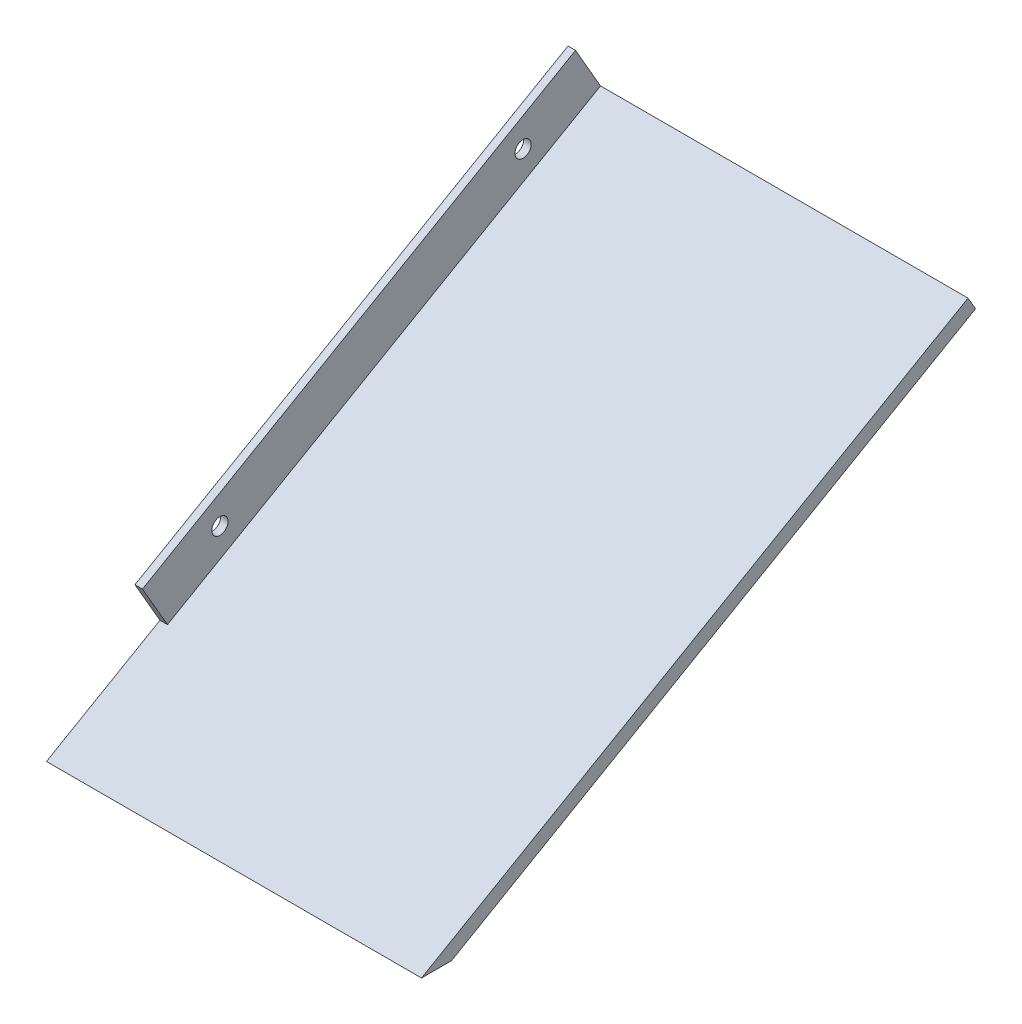
ISO-10303-21;
HEADER;
FILE_DESCRIPTION(('STEP AP214'),'2;1');
FILE_NAME('part.step','',(''),(''),'','','');
FILE_SCHEMA(('AUTOMOTIVE_DESIGN { 1 0 10303 214 1 1 1 1 }'));
ENDSEC;
DATA;
#1=APPLICATION_CONTEXT('core data for automotive mechanical design processes');
#2=APPLICATION_PROTOCOL_DEFINITION('international standard','automotive_design',2000,#1);
#3=PRODUCT_CONTEXT('',#1,'mechanical');
#4=PRODUCT('Part','Part','',(#3));
#5=PRODUCT_RELATED_PRODUCT_CATEGORY('part','',(#4));
#6=PRODUCT_DEFINITION_FORMATION('','',#4);
#7=PRODUCT_DEFINITION_CONTEXT('part definition',#1,'design');
#8=PRODUCT_DEFINITION('design','',#6,#7);
#9=PRODUCT_DEFINITION_SHAPE('','',#8);
#10=(LENGTH_UNIT() NAMED_UNIT(*) SI_UNIT(.MILLI.,.METRE.));
#11=(NAMED_UNIT(*) PLANE_ANGLE_UNIT() SI_UNIT($,.RADIAN.));
#12=(NAMED_UNIT(*) SI_UNIT($,.STERADIAN.) SOLID_ANGLE_UNIT());
#13=UNCERTAINTY_MEASURE_WITH_UNIT(LENGTH_MEASURE(1.E-05),#10,'distance_accuracy_value','');
#14=(GEOMETRIC_REPRESENTATION_CONTEXT(3) GLOBAL_UNCERTAINTY_ASSIGNED_CONTEXT((#13)) GLOBAL_UNIT_ASSIGNED_CONTEXT((#10,
#11,#12)) REPRESENTATION_CONTEXT('',''));
#15=CARTESIAN_POINT('',(0.,0.,0.));
#16=DIRECTION('',(0.,0.,1.));
#17=DIRECTION('',(1.,0.,0.));
#18=AXIS2_PLACEMENT_3D('',#15,#16,#17);
#19=CARTESIAN_POINT('',(75.,-27.3023218635217,71.8898729481506));
#20=DIRECTION('',(0.,-0.866025403784438,-0.500000000000001));
#21=DIRECTION('',(0.,0.500000000000001,-0.866025403784438));
#22=AXIS2_PLACEMENT_3D('',#19,#20,#21);
#23=PLANE('',#22);
#24=DIRECTION('',(1.,0.,0.));
#25=VECTOR('',#24,1.);
#26=CARTESIAN_POINT('',(0.,-14.1992456521683,49.1946792146396));
#27=LINE('',#26,#25);
#28=CARTESIAN_POINT('',(0.,-14.1992456521683,49.1946792146396));
#29=VERTEX_POINT('',#28);
#30=CARTESIAN_POINT('',(1.50000000000001,-14.1992456521683,49.1946792146396));
#31=VERTEX_POINT('',#30);
#32=EDGE_CURVE('E173',#29,#31,#27,.T.);
#33=ORIENTED_EDGE('',*,*,#32,.F.);
#34=DIRECTION('',(0.,-0.500000000000001,0.866025403784438));
#35=VECTOR('',#34,1.);
#36=CARTESIAN_POINT('',(0.,-27.3023218635217,71.8898729481506));
#37=LINE('',#36,#35);
#38=CARTESIAN_POINT('',(0.,-27.3023218635217,71.8898729481506));
#39=VERTEX_POINT('',#38);
#40=EDGE_CURVE('E124',#29,#39,#37,.T.);
#41=ORIENTED_EDGE('',*,*,#40,.T.);
#42=DIRECTION('',(-1.,0.,0.));
#43=VECTOR('',#42,1.);
#44=CARTESIAN_POINT('',(75.,-27.3023218635217,71.8898729481506));
#45=LINE('',#44,#43);
#46=CARTESIAN_POINT('',(75.,-27.3023218635217,71.8898729481506));
#47=VERTEX_POINT('',#46);
#48=EDGE_CURVE('E11',#47,#39,#45,.T.);
#49=ORIENTED_EDGE('',*,*,#48,.F.);
#50=DIRECTION('',(0.,-0.500000000000001,0.866025403784438));
#51=VECTOR('',#50,1.);
#52=CARTESIAN_POINT('',(75.,-27.3023218635217,71.8898729481506));
#53=LINE('',#52,#51);
#54=CARTESIAN_POINT('',(75.,35.8007543478318,-37.4078611638042));
#55=VERTEX_POINT('',#54);
#56=EDGE_CURVE('E135',#55,#47,#53,.T.);
#57=ORIENTED_EDGE('',*,*,#56,.F.);
#58=DIRECTION('',(-1.,0.,0.));
#59=VECTOR('',#58,1.);
#60=CARTESIAN_POINT('',(75.,35.8007543478318,-37.4078611638042));
#61=LINE('',#60,#59);
#62=CARTESIAN_POINT('',(1.50000000000002,35.8007543478318,-37.4078611638042));
#63=VERTEX_POINT('',#62);
#64=EDGE_CURVE('E61',#55,#63,#61,.T.);
#65=ORIENTED_EDGE('',*,*,#64,.T.);
#66=DIRECTION('',(0.,0.500000000000001,-0.866025403784438));
#67=VECTOR('',#66,1.);
#68=CARTESIAN_POINT('',(1.5,35.8007543478318,-37.4078611638042));
#69=LINE('',#68,#67);
#70=EDGE_CURVE('E56',#31,#63,#69,.T.);
#71=ORIENTED_EDGE('',*,*,#70,.F.);
#72=EDGE_LOOP('',(#33,#41,#49,#57,#65,#71));
#73=FACE_BOUND('',#72,.T.);
#74=ADVANCED_FACE('F39',(#73),#23,.F.);
#75=CARTESIAN_POINT('',(75.,-27.3023218635217,71.8898729481506));
#76=DIRECTION('',(0.,1.,0.));
#77=DIRECTION('',(0.,0.,1.));
#78=AXIS2_PLACEMENT_3D('',#75,#76,#77);
#79=PLANE('',#78);
#80=DIRECTION('',(0.,0.,-1.));
#81=VECTOR('',#80,1.);
#82=CARTESIAN_POINT('',(0.,-27.3023218635217,71.8898729481506));
#83=LINE('',#82,#81);
#84=CARTESIAN_POINT('',(0.,-27.3023218635217,65.8898729481506));
#85=VERTEX_POINT('',#84);
#86=EDGE_CURVE('E129',#39,#85,#83,.T.);
#87=ORIENTED_EDGE('',*,*,#86,.T.);
#88=DIRECTION('',(-1.,0.,0.));
#89=VECTOR('',#88,1.);
#90=CARTESIAN_POINT('',(75.,-27.3023218635217,65.8898729481506));
#91=LINE('',#90,#89);
#92=CARTESIAN_POINT('',(75.,-27.3023218635217,65.8898729481506));
#93=VERTEX_POINT('',#92);
#94=EDGE_CURVE('E48',#93,#85,#91,.T.);
#95=ORIENTED_EDGE('',*,*,#94,.F.);
#96=DIRECTION('',(0.,0.,-1.));
#97=VECTOR('',#96,1.);
#98=CARTESIAN_POINT('',(75.,-27.3023218635217,71.8898729481506));
#99=LINE('',#98,#97);
#100=EDGE_CURVE('E139',#47,#93,#99,.T.);
#101=ORIENTED_EDGE('',*,*,#100,.F.);
#102=ORIENTED_EDGE('',*,*,#48,.T.);
#103=EDGE_LOOP('',(#87,#95,#101,#102));
#104=FACE_BOUND('',#103,.T.);
#105=ADVANCED_FACE('F209',(#104),#79,.F.);
#106=CARTESIAN_POINT('',(75.,-27.3023218635217,65.8898729481506));
#107=DIRECTION('',(0.,0.866025403784438,0.500000000000001));
#108=DIRECTION('',(0.,-0.500000000000001,0.866025403784438));
#109=AXIS2_PLACEMENT_3D('',#106,#107,#108);
#110=PLANE('',#109);
#111=DIRECTION('',(0.,0.500000000000001,-0.866025403784438));
#112=VECTOR('',#111,1.);
#113=CARTESIAN_POINT('',(0.,-27.3023218635217,65.8898729481506));
#114=LINE('',#113,#112);
#115=CARTESIAN_POINT('',(0.,33.2026781364785,-38.9078611638042));
#116=VERTEX_POINT('',#115);
#117=EDGE_CURVE('E151',#85,#116,#114,.T.);
#118=ORIENTED_EDGE('',*,*,#117,.T.);
#119=DIRECTION('',(-1.,0.,0.));
#120=VECTOR('',#119,1.);
#121=CARTESIAN_POINT('',(75.,33.2026781364785,-38.9078611638042));
#122=LINE('',#121,#120);
#123=CARTESIAN_POINT('',(75.,33.2026781364785,-38.9078611638042));
#124=VERTEX_POINT('',#123);
#125=EDGE_CURVE('E158',#124,#116,#122,.T.);
#126=ORIENTED_EDGE('',*,*,#125,.F.);
#127=DIRECTION('',(0.,0.500000000000001,-0.866025403784438));
#128=VECTOR('',#127,1.);
#129=CARTESIAN_POINT('',(75.,-27.3023218635217,65.8898729481506));
#130=LINE('',#129,#128);
#131=EDGE_CURVE('E143',#93,#124,#130,.T.);
#132=ORIENTED_EDGE('',*,*,#131,.F.);
#133=ORIENTED_EDGE('',*,*,#94,.T.);
#134=EDGE_LOOP('',(#118,#126,#132,#133));
#135=FACE_BOUND('',#134,.T.);
#136=ADVANCED_FACE('F213',(#135),#110,.F.);
#137=CARTESIAN_POINT('',(75.,33.2026781364785,-38.9078611638042));
#138=DIRECTION('',(0.,-0.500000000000007,0.866025403784434));
#139=DIRECTION('',(0.,-0.866025403784435,-0.500000000000007));
#140=AXIS2_PLACEMENT_3D('',#137,#138,#139);
#141=PLANE('',#140);
#142=DIRECTION('',(0.,0.866025403784435,0.500000000000007));
#143=VECTOR('',#142,1.);
#144=CARTESIAN_POINT('',(0.,33.2026781364785,-38.9078611638042));
#145=LINE('',#144,#143);
#146=CARTESIAN_POINT('',(0.,44.4610083856762,-32.4078611638042));
#147=VERTEX_POINT('',#146);
#148=EDGE_CURVE('E140',#116,#147,#145,.T.);
#149=ORIENTED_EDGE('',*,*,#148,.T.);
#150=DIRECTION('',(-1.,0.,0.));
#151=VECTOR('',#150,1.);
#152=CARTESIAN_POINT('',(0.,44.4610083856762,-32.4078611638042));
#153=LINE('',#152,#151);
#154=CARTESIAN_POINT('',(1.5,44.4610083856762,-32.4078611638042));
#155=VERTEX_POINT('',#154);
#156=EDGE_CURVE('E117',#155,#147,#153,.T.);
#157=ORIENTED_EDGE('',*,*,#156,.F.);
#158=DIRECTION('',(0.,-0.866025403784438,-0.500000000000001));
#159=VECTOR('',#158,1.);
#160=CARTESIAN_POINT('',(1.5,44.4610083856762,-32.4078611638042));
#161=LINE('',#160,#159);
#162=EDGE_CURVE('E131',#155,#63,#161,.T.);
#163=ORIENTED_EDGE('',*,*,#162,.T.);
#164=ORIENTED_EDGE('',*,*,#64,.F.);
#165=DIRECTION('',(0.,0.866025403784435,0.500000000000007));
#166=VECTOR('',#165,1.);
#167=CARTESIAN_POINT('',(75.,33.2026781364785,-38.9078611638042));
#168=LINE('',#167,#166);
#169=EDGE_CURVE('E146',#124,#55,#168,.T.);
#170=ORIENTED_EDGE('',*,*,#169,.F.);
#171=ORIENTED_EDGE('',*,*,#125,.T.);
#172=EDGE_LOOP('',(#149,#157,#163,#164,#170,#171));
#173=FACE_BOUND('',#172,.T.);
#174=ADVANCED_FACE('F194',(#173),#141,.F.);
#175=CARTESIAN_POINT('',(75.,0.,0.));
#176=DIRECTION('',(1.,0.,0.));
#177=DIRECTION('',(0.,0.,-1.));
#178=AXIS2_PLACEMENT_3D('',#175,#176,#177);
#179=PLANE('',#178);
#180=ORIENTED_EDGE('',*,*,#56,.T.);
#181=ORIENTED_EDGE('',*,*,#100,.T.);
#182=ORIENTED_EDGE('',*,*,#131,.T.);
#183=ORIENTED_EDGE('',*,*,#169,.T.);
#184=EDGE_LOOP('',(#180,#181,#182,#183));
#185=FACE_BOUND('',#184,.T.);
#186=ADVANCED_FACE('F220',(#185),#179,.T.);
#187=CARTESIAN_POINT('',(0.,0.,0.));
#188=DIRECTION('',(1.,0.,0.));
#189=DIRECTION('',(0.,0.,-1.));
#190=AXIS2_PLACEMENT_3D('',#187,#188,#189);
#191=PLANE('',#190);
#192=CARTESIAN_POINT('',(0.,32.630881366754,-21.9174801070377));
#193=DIRECTION('',(-1.,0.,0.));
#194=DIRECTION('',(0.,0.,1.));
#195=AXIS2_PLACEMENT_3D('',#192,#193,#194);
#196=CIRCLE('',#195,1.625);
#197=CARTESIAN_POINT('',(0.,32.630881366754,-20.2924801070377));
#198=VERTEX_POINT('',#197);
#199=EDGE_CURVE('E167',#198,#198,#196,.T.);
#200=ORIENTED_EDGE('',*,*,#199,.F.);
#201=EDGE_LOOP('',(#200));
#202=FACE_BOUND('',#201,.T.);
#203=CARTESIAN_POINT('',(0.,-2.36911863324602,38.7042981578731));
#204=DIRECTION('',(-1.,0.,0.));
#205=DIRECTION('',(0.,0.,1.));
#206=AXIS2_PLACEMENT_3D('',#203,#204,#205);
#207=CIRCLE('',#206,1.625);
#208=CARTESIAN_POINT('',(0.,-2.36911863324602,40.3292981578731));
#209=VERTEX_POINT('',#208);
#210=EDGE_CURVE('E175',#209,#209,#207,.T.);
#211=ORIENTED_EDGE('',*,*,#210,.F.);
#212=EDGE_LOOP('',(#211));
#213=FACE_BOUND('',#212,.T.);
#214=ORIENTED_EDGE('',*,*,#40,.F.);
#215=DIRECTION('',(0.,-0.866025403784438,-0.500000000000001));
#216=VECTOR('',#215,1.);
#217=CARTESIAN_POINT('',(0.,-5.53899161432394,54.1946792146396));
#218=LINE('',#217,#216);
#219=CARTESIAN_POINT('',(0.,-5.53899161432394,54.1946792146396));
#220=VERTEX_POINT('',#219);
#221=EDGE_CURVE('E104',#220,#29,#218,.T.);
#222=ORIENTED_EDGE('',*,*,#221,.F.);
#223=DIRECTION('',(0.,-0.500000000000001,0.866025403784438));
#224=VECTOR('',#223,1.);
#225=CARTESIAN_POINT('',(0.,44.4610083856762,-32.4078611638042));
#226=LINE('',#225,#224);
#227=EDGE_CURVE('E111',#147,#220,#226,.T.);
#228=ORIENTED_EDGE('',*,*,#227,.F.);
#229=ORIENTED_EDGE('',*,*,#148,.F.);
#230=ORIENTED_EDGE('',*,*,#117,.F.);
#231=ORIENTED_EDGE('',*,*,#86,.F.);
#232=EDGE_LOOP('',(#214,#222,#228,#229,#230,#231));
#233=FACE_BOUND('',#232,.T.);
#234=ADVANCED_FACE('F122',(#202,#213,#233),#191,.F.);
#235=CARTESIAN_POINT('',(0.,-5.53899161432394,54.1946792146396));
#236=DIRECTION('',(0.,0.500000000000001,-0.866025403784438));
#237=DIRECTION('',(0.,0.866025403784438,0.500000000000001));
#238=AXIS2_PLACEMENT_3D('',#235,#236,#237);
#239=PLANE('',#238);
#240=ORIENTED_EDGE('',*,*,#32,.T.);
#241=DIRECTION('',(0.,-0.866025403784438,-0.500000000000001));
#242=VECTOR('',#241,1.);
#243=CARTESIAN_POINT('',(1.50000000000001,-5.53899161432394,54.1946792146396));
#244=LINE('',#243,#242);
#245=CARTESIAN_POINT('',(1.50000000000001,-5.53899161432394,54.1946792146396));
#246=VERTEX_POINT('',#245);
#247=EDGE_CURVE('E106',#246,#31,#244,.T.);
#248=ORIENTED_EDGE('',*,*,#247,.F.);
#249=DIRECTION('',(1.,0.,0.));
#250=VECTOR('',#249,1.);
#251=CARTESIAN_POINT('',(0.,-5.53899161432394,54.1946792146396));
#252=LINE('',#251,#250);
#253=EDGE_CURVE('E100',#220,#246,#252,.T.);
#254=ORIENTED_EDGE('',*,*,#253,.F.);
#255=ORIENTED_EDGE('',*,*,#221,.T.);
#256=EDGE_LOOP('',(#240,#248,#254,#255));
#257=FACE_BOUND('',#256,.T.);
#258=ADVANCED_FACE('F102',(#257),#239,.F.);
#259=CARTESIAN_POINT('',(1.5,44.4610083856762,-32.4078611638042));
#260=DIRECTION('',(-1.,0.,0.));
#261=DIRECTION('',(0.,0.,1.));
#262=AXIS2_PLACEMENT_3D('',#259,#260,#261);
#263=PLANE('',#262);
#264=CARTESIAN_POINT('',(1.5,32.630881366754,-21.9174801070377));
#265=DIRECTION('',(-1.,0.,0.));
#266=DIRECTION('',(0.,0.,1.));
#267=AXIS2_PLACEMENT_3D('',#264,#265,#266);
#268=CIRCLE('',#267,1.625);
#269=CARTESIAN_POINT('',(1.5,32.630881366754,-20.2924801070377));
#270=VERTEX_POINT('',#269);
#271=EDGE_CURVE('E42',#270,#270,#268,.T.);
#272=ORIENTED_EDGE('',*,*,#271,.T.);
#273=EDGE_LOOP('',(#272));
#274=FACE_BOUND('',#273,.T.);
#275=CARTESIAN_POINT('',(1.50000000000002,-2.36911863324602,38.7042981578731));
#276=DIRECTION('',(-1.,0.,0.));
#277=DIRECTION('',(0.,0.,1.));
#278=AXIS2_PLACEMENT_3D('',#275,#276,#277);
#279=CIRCLE('',#278,1.625);
#280=CARTESIAN_POINT('',(1.50000000000002,-2.36911863324602,40.3292981578731));
#281=VERTEX_POINT('',#280);
#282=EDGE_CURVE('E164',#281,#281,#279,.T.);
#283=ORIENTED_EDGE('',*,*,#282,.T.);
#284=EDGE_LOOP('',(#283));
#285=FACE_BOUND('',#284,.T.);
#286=ORIENTED_EDGE('',*,*,#70,.T.);
#287=ORIENTED_EDGE('',*,*,#162,.F.);
#288=DIRECTION('',(0.,0.500000000000001,-0.866025403784438));
#289=VECTOR('',#288,1.);
#290=CARTESIAN_POINT('',(1.5,44.4610083856762,-32.4078611638042));
#291=LINE('',#290,#289);
#292=EDGE_CURVE('E110',#246,#155,#291,.T.);
#293=ORIENTED_EDGE('',*,*,#292,.F.);
#294=ORIENTED_EDGE('',*,*,#247,.T.);
#295=EDGE_LOOP('',(#286,#287,#293,#294));
#296=FACE_BOUND('',#295,.T.);
#297=ADVANCED_FACE('F197',(#274,#285,#296),#263,.F.);
#298=CARTESIAN_POINT('',(0.,19.3127407641703,11.1502160789832));
#299=DIRECTION('',(0.,0.866025403784438,0.500000000000001));
#300=DIRECTION('',(0.,-0.500000000000001,0.866025403784438));
#301=AXIS2_PLACEMENT_3D('',#298,#299,#300);
#302=PLANE('',#301);
#303=ORIENTED_EDGE('',*,*,#227,.T.);
#304=ORIENTED_EDGE('',*,*,#253,.T.);
#305=ORIENTED_EDGE('',*,*,#292,.T.);
#306=ORIENTED_EDGE('',*,*,#156,.T.);
#307=EDGE_LOOP('',(#303,#304,#305,#306));
#308=FACE_BOUND('',#307,.T.);
#309=ADVANCED_FACE('F115',(#308),#302,.T.);
#310=CARTESIAN_POINT('',(75.,-2.36911863324602,38.7042981578731));
#311=DIRECTION('',(-1.,0.,0.));
#312=DIRECTION('',(0.,0.,1.));
#313=AXIS2_PLACEMENT_3D('',#310,#311,#312);
#314=CYLINDRICAL_SURFACE('',#313,1.625);
#315=ORIENTED_EDGE('',*,*,#210,.T.);
#316=EDGE_LOOP('',(#315));
#317=FACE_BOUND('',#316,.T.);
#318=ORIENTED_EDGE('',*,*,#282,.F.);
#319=EDGE_LOOP('',(#318));
#320=FACE_BOUND('',#319,.T.);
#321=ADVANCED_FACE('F205',(#317,#320),#314,.F.);
#322=CARTESIAN_POINT('',(75.,32.630881366754,-21.9174801070377));
#323=DIRECTION('',(-1.,0.,0.));
#324=DIRECTION('',(0.,0.,1.));
#325=AXIS2_PLACEMENT_3D('',#322,#323,#324);
#326=CYLINDRICAL_SURFACE('',#325,1.625);
#327=ORIENTED_EDGE('',*,*,#199,.T.);
#328=EDGE_LOOP('',(#327));
#329=FACE_BOUND('',#328,.T.);
#330=ORIENTED_EDGE('',*,*,#271,.F.);
#331=EDGE_LOOP('',(#330));
#332=FACE_BOUND('',#331,.T.);
#333=ADVANCED_FACE('F264',(#329,#332),#326,.F.);
#334=CLOSED_SHELL('',(#74,#105,#136,#174,#186,#234,#258,#297,#309,#321,#333));
#335=MANIFOLD_SOLID_BREP('B2',#334);
#336=ADVANCED_BREP_SHAPE_REPRESENTATION('',(#18,#335),#14);
#337=SHAPE_DEFINITION_REPRESENTATION(#9,#336);
ENDSEC;
END-ISO-10303-21;
